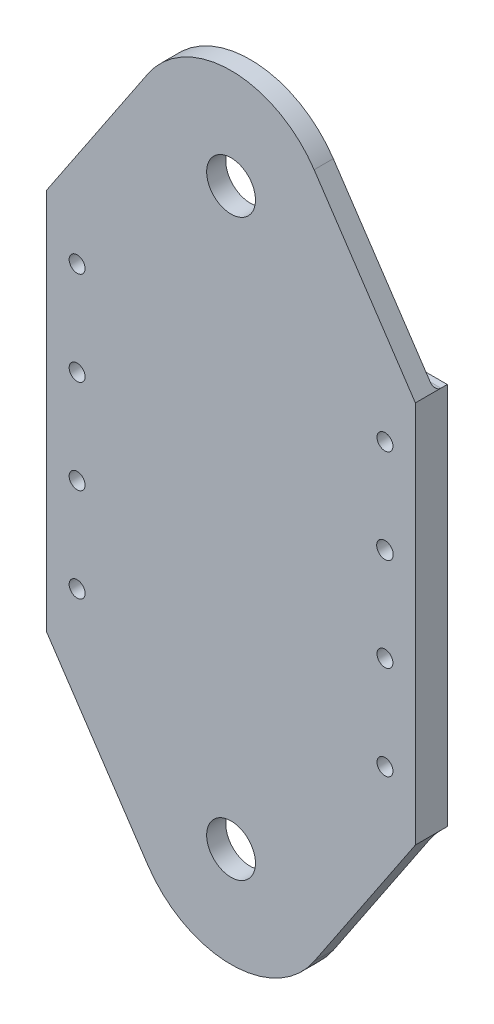
ISO-10303-21;
HEADER;
FILE_DESCRIPTION(('STEP AP214'),'2;1');
FILE_NAME('part.step','',(''),(''),'','','');
FILE_SCHEMA(('AUTOMOTIVE_DESIGN { 1 0 10303 214 1 1 1 1 }'));
ENDSEC;
DATA;
#1=APPLICATION_CONTEXT('core data for automotive mechanical design processes');
#2=APPLICATION_PROTOCOL_DEFINITION('international standard','automotive_design',2000,#1);
#3=PRODUCT_CONTEXT('',#1,'mechanical');
#4=PRODUCT('Part','Part','',(#3));
#5=PRODUCT_RELATED_PRODUCT_CATEGORY('part','',(#4));
#6=PRODUCT_DEFINITION_FORMATION('','',#4);
#7=PRODUCT_DEFINITION_CONTEXT('part definition',#1,'design');
#8=PRODUCT_DEFINITION('design','',#6,#7);
#9=PRODUCT_DEFINITION_SHAPE('','',#8);
#10=(LENGTH_UNIT() NAMED_UNIT(*) SI_UNIT(.MILLI.,.METRE.));
#11=(NAMED_UNIT(*) PLANE_ANGLE_UNIT() SI_UNIT($,.RADIAN.));
#12=(NAMED_UNIT(*) SI_UNIT($,.STERADIAN.) SOLID_ANGLE_UNIT());
#13=UNCERTAINTY_MEASURE_WITH_UNIT(LENGTH_MEASURE(1.E-05),#10,'distance_accuracy_value','');
#14=(GEOMETRIC_REPRESENTATION_CONTEXT(3) GLOBAL_UNCERTAINTY_ASSIGNED_CONTEXT((#13)) GLOBAL_UNIT_ASSIGNED_CONTEXT((#10,
#11,#12)) REPRESENTATION_CONTEXT('',''));
#15=CARTESIAN_POINT('',(0.,0.,0.));
#16=DIRECTION('',(0.,0.,1.));
#17=DIRECTION('',(1.,0.,0.));
#18=AXIS2_PLACEMENT_3D('',#15,#16,#17);
#19=CARTESIAN_POINT('',(-34.236310317154,-152.4,12.7));
#20=DIRECTION('',(0.,0.,1.));
#21=DIRECTION('',(1.,0.,0.));
#22=AXIS2_PLACEMENT_3D('',#19,#20,#21);
#23=PLANE('',#22);
#24=CARTESIAN_POINT('',(-22.1314502247129,-19.4468749363711,12.7000006965658));
#25=DIRECTION('',(-4.21051182115549E-09,-6.66920905280793E-09,-1.));
#26=DIRECTION('',(0.,1.,-6.66920905280793E-09));
#27=AXIS2_PLACEMENT_3D('',#24,#25,#26);
#28=CIRCLE('',#27,3.175);
#29=CARTESIAN_POINT('',(-22.1314502247129,-16.2718749363711,12.7000006753911));
#30=VERTEX_POINT('',#29);
#31=EDGE_CURVE('E185',#30,#30,#28,.T.);
#32=ORIENTED_EDGE('',*,*,#31,.T.);
#33=EDGE_LOOP('',(#32));
#34=FACE_BOUND('',#33,.T.);
#35=CARTESIAN_POINT('',(-22.1314502642833,-131.429124851126,12.7000014433989));
#36=DIRECTION('',(-4.21051182115549E-09,-6.66920905280793E-09,-1.));
#37=DIRECTION('',(0.,1.,-6.66920905280793E-09));
#38=AXIS2_PLACEMENT_3D('',#35,#36,#37);
#39=CIRCLE('',#38,3.175);
#40=CARTESIAN_POINT('',(-22.1314502642833,-128.254124851126,12.7000014222241));
#41=VERTEX_POINT('',#40);
#42=EDGE_CURVE('E190',#41,#41,#39,.T.);
#43=ORIENTED_EDGE('',*,*,#42,.T.);
#44=EDGE_LOOP('',(#43));
#45=FACE_BOUND('',#44,.T.);
#46=CARTESIAN_POINT('',(-22.1314502642833,-94.0911248511257,12.700001194384));
#47=DIRECTION('',(-4.21051182115549E-09,-6.66920905280793E-09,-1.));
#48=DIRECTION('',(0.,1.,-6.66920905280793E-09));
#49=AXIS2_PLACEMENT_3D('',#46,#47,#48);
#50=CIRCLE('',#49,3.175);
#51=CARTESIAN_POINT('',(-22.1314502642833,-90.9161248511257,12.7000011732092));
#52=VERTEX_POINT('',#51);
#53=EDGE_CURVE('E194',#52,#52,#50,.T.);
#54=ORIENTED_EDGE('',*,*,#53,.T.);
#55=EDGE_LOOP('',(#54));
#56=FACE_BOUND('',#55,.T.);
#57=CARTESIAN_POINT('',(-22.1314502642833,-56.7531250233898,12.700000945369));
#58=DIRECTION('',(-4.21051182115549E-09,-6.66920905280793E-09,-1.));
#59=DIRECTION('',(0.,1.,-6.66920905280793E-09));
#60=AXIS2_PLACEMENT_3D('',#57,#58,#59);
#61=CIRCLE('',#60,3.175);
#62=CARTESIAN_POINT('',(-22.1314502642833,-53.5781250233898,12.7000009241943));
#63=VERTEX_POINT('',#62);
#64=EDGE_CURVE('E198',#63,#63,#61,.T.);
#65=ORIENTED_EDGE('',*,*,#64,.T.);
#66=EDGE_LOOP('',(#65));
#67=FACE_BOUND('',#66,.T.);
#68=CARTESIAN_POINT('',(100.395913167952,-131.429124851126,12.700000927496));
#69=DIRECTION('',(-4.21051182115549E-09,-6.66920905280793E-09,-1.));
#70=DIRECTION('',(0.,1.,-6.66920905280793E-09));
#71=AXIS2_PLACEMENT_3D('',#68,#69,#70);
#72=CIRCLE('',#71,3.175);
#73=CARTESIAN_POINT('',(100.395913167952,-128.254124851126,12.7000009063212));
#74=VERTEX_POINT('',#73);
#75=EDGE_CURVE('E202',#74,#74,#72,.T.);
#76=ORIENTED_EDGE('',*,*,#75,.T.);
#77=EDGE_LOOP('',(#76));
#78=FACE_BOUND('',#77,.T.);
#79=CARTESIAN_POINT('',(100.395913167952,-94.0911248511257,12.700000678481));
#80=DIRECTION('',(-4.21051182115549E-09,-6.66920905280793E-09,-1.));
#81=DIRECTION('',(0.,1.,-6.66920905280793E-09));
#82=AXIS2_PLACEMENT_3D('',#79,#80,#81);
#83=CIRCLE('',#82,3.17500000000001);
#84=CARTESIAN_POINT('',(100.395913167952,-90.9161248511256,12.7000006573063));
#85=VERTEX_POINT('',#84);
#86=EDGE_CURVE('E206',#85,#85,#83,.T.);
#87=ORIENTED_EDGE('',*,*,#86,.T.);
#88=EDGE_LOOP('',(#87));
#89=FACE_BOUND('',#88,.T.);
#90=CARTESIAN_POINT('',(100.395913167952,-56.7531248511257,12.7000004294661));
#91=DIRECTION('',(-4.21051182115549E-09,-6.66920905280793E-09,-1.));
#92=DIRECTION('',(0.,1.,-6.66920905280793E-09));
#93=AXIS2_PLACEMENT_3D('',#90,#91,#92);
#94=CIRCLE('',#93,3.30173915819777);
#95=CARTESIAN_POINT('',(100.395913167952,-53.4513856929279,12.7000004074461));
#96=VERTEX_POINT('',#95);
#97=EDGE_CURVE('E210',#96,#96,#94,.T.);
#98=ORIENTED_EDGE('',*,*,#97,.T.);
#99=EDGE_LOOP('',(#98));
#100=FACE_BOUND('',#99,.T.);
#101=CARTESIAN_POINT('',(100.395913127435,-19.4468749153011,12.7000001806629));
#102=DIRECTION('',(-4.21051182115549E-09,-6.66920905280793E-09,-1.));
#103=DIRECTION('',(0.,1.,-6.66920905280793E-09));
#104=AXIS2_PLACEMENT_3D('',#101,#102,#103);
#105=CIRCLE('',#104,3.175);
#106=CARTESIAN_POINT('',(100.395913127435,-16.2718749153011,12.7000001594882));
#107=VERTEX_POINT('',#106);
#108=EDGE_CURVE('E214',#107,#107,#105,.T.);
#109=ORIENTED_EDGE('',*,*,#108,.T.);
#110=EDGE_LOOP('',(#109));
#111=FACE_BOUND('',#110,.T.);
#112=DIRECTION('',(0.,-1.,0.));
#113=VECTOR('',#112,1.);
#114=CARTESIAN_POINT('',(-34.236310317154,0.,12.7));
#115=LINE('',#114,#113);
#116=CARTESIAN_POINT('',(-34.236310317154,0.,12.7));
#117=VERTEX_POINT('',#116);
#118=CARTESIAN_POINT('',(-34.236310317154,-152.4,12.7));
#119=VERTEX_POINT('',#118);
#120=EDGE_CURVE('E218',#117,#119,#115,.T.);
#121=ORIENTED_EDGE('',*,*,#120,.T.);
#122=DIRECTION('',(0.556036674459193,-0.831157756780481,0.));
#123=VECTOR('',#122,1.);
#124=CARTESIAN_POINT('',(-34.236310317154,-152.4,12.7));
#125=LINE('',#124,#123);
#126=CARTESIAN_POINT('',(6.05561424166053,-212.627943894608,12.7));
#127=VERTEX_POINT('',#126);
#128=EDGE_CURVE('E157',#119,#127,#125,.T.);
#129=ORIENTED_EDGE('',*,*,#128,.T.);
#130=CARTESIAN_POINT('',(39.1322314045388,-190.5,12.7));
#131=DIRECTION('',(0.,0.,1.));
#132=DIRECTION('',(-1.,0.,0.));
#133=AXIS2_PLACEMENT_3D('',#130,#131,#132);
#134=CIRCLE('',#133,39.7958352587621);
#135=CARTESIAN_POINT('',(72.208848567417,-212.627943894608,12.7));
#136=VERTEX_POINT('',#135);
#137=EDGE_CURVE('E143',#127,#136,#134,.T.);
#138=ORIENTED_EDGE('',*,*,#137,.T.);
#139=DIRECTION('',(0.556036674459194,0.83115775678048,0.));
#140=VECTOR('',#139,1.);
#141=CARTESIAN_POINT('',(112.500773126232,-152.4,12.7));
#142=LINE('',#141,#140);
#143=CARTESIAN_POINT('',(112.500773126232,-152.4,12.7));
#144=VERTEX_POINT('',#143);
#145=EDGE_CURVE('E154',#136,#144,#142,.T.);
#146=ORIENTED_EDGE('',*,*,#145,.T.);
#147=DIRECTION('',(0.,1.,0.));
#148=VECTOR('',#147,1.);
#149=CARTESIAN_POINT('',(112.500773126232,0.,12.7));
#150=LINE('',#149,#148);
#151=CARTESIAN_POINT('',(112.500773126232,0.,12.7));
#152=VERTEX_POINT('',#151);
#153=EDGE_CURVE('E221',#144,#152,#150,.T.);
#154=ORIENTED_EDGE('',*,*,#153,.T.);
#155=DIRECTION('',(-0.556036674459194,0.83115775678048,0.));
#156=VECTOR('',#155,1.);
#157=CARTESIAN_POINT('',(112.500773126232,0.,12.7));
#158=LINE('',#157,#156);
#159=CARTESIAN_POINT('',(72.208848567417,60.227943894608,12.7));
#160=VERTEX_POINT('',#159);
#161=EDGE_CURVE('E176',#152,#160,#158,.T.);
#162=ORIENTED_EDGE('',*,*,#161,.T.);
#163=CARTESIAN_POINT('',(39.1322314045388,38.1,12.7));
#164=DIRECTION('',(0.,0.,1.));
#165=DIRECTION('',(1.,0.,0.));
#166=AXIS2_PLACEMENT_3D('',#163,#164,#165);
#167=CIRCLE('',#166,39.7958352587621);
#168=CARTESIAN_POINT('',(6.05561424166053,60.227943894608,12.7));
#169=VERTEX_POINT('',#168);
#170=EDGE_CURVE('E179',#160,#169,#167,.T.);
#171=ORIENTED_EDGE('',*,*,#170,.T.);
#172=DIRECTION('',(-0.556036674459192,-0.831157756780481,0.));
#173=VECTOR('',#172,1.);
#174=CARTESIAN_POINT('',(-34.236310317154,0.,12.7));
#175=LINE('',#174,#173);
#176=EDGE_CURVE('E166',#169,#117,#175,.T.);
#177=ORIENTED_EDGE('',*,*,#176,.T.);
#178=EDGE_LOOP('',(#121,#129,#138,#146,#154,#162,#171,#177));
#179=FACE_BOUND('',#178,.T.);
#180=CARTESIAN_POINT('',(39.1322314045388,38.1,12.7));
#181=DIRECTION('',(0.,0.,1.));
#182=DIRECTION('',(1.,0.,0.));
#183=AXIS2_PLACEMENT_3D('',#180,#181,#182);
#184=CIRCLE('',#183,9.71153050508892);
#185=CARTESIAN_POINT('',(48.8437619096277,38.1,12.7));
#186=VERTEX_POINT('',#185);
#187=EDGE_CURVE('E161',#186,#186,#184,.T.);
#188=ORIENTED_EDGE('',*,*,#187,.F.);
#189=EDGE_LOOP('',(#188));
#190=FACE_BOUND('',#189,.T.);
#191=CARTESIAN_POINT('',(39.1322314045388,-190.5,12.7));
#192=DIRECTION('',(0.,0.,1.));
#193=DIRECTION('',(-1.,0.,0.));
#194=AXIS2_PLACEMENT_3D('',#191,#192,#193);
#195=CIRCLE('',#194,9.7115305050889);
#196=CARTESIAN_POINT('',(48.8437619096277,-190.5,12.7));
#197=VERTEX_POINT('',#196);
#198=EDGE_CURVE('E152',#197,#197,#195,.T.);
#199=ORIENTED_EDGE('',*,*,#198,.F.);
#200=EDGE_LOOP('',(#199));
#201=FACE_BOUND('',#200,.T.);
#202=ADVANCED_FACE('F33',(#34,#45,#56,#67,#78,#89,#100,#111,#179,#190,#201),#23,.T.);
#203=CARTESIAN_POINT('',(-34.236310317154,-152.4,0.));
#204=DIRECTION('',(0.,0.,1.));
#205=DIRECTION('',(1.,0.,0.));
#206=AXIS2_PLACEMENT_3D('',#203,#204,#205);
#207=PLANE('',#206);
#208=CARTESIAN_POINT('',(-22.1314502781864,-19.4468750210701,0.));
#209=DIRECTION('',(0.,0.,1.));
#210=DIRECTION('',(1.,0.,0.));
#211=AXIS2_PLACEMENT_3D('',#208,#209,#210);
#212=CIRCLE('',#211,3.175);
#213=CARTESIAN_POINT('',(-18.9564502781864,-19.4468750210701,0.));
#214=VERTEX_POINT('',#213);
#215=EDGE_CURVE('E189',#214,#214,#212,.T.);
#216=ORIENTED_EDGE('',*,*,#215,.T.);
#217=EDGE_LOOP('',(#216));
#218=FACE_BOUND('',#217,.T.);
#219=CARTESIAN_POINT('',(-22.1314503177568,-131.429124935825,0.));
#220=DIRECTION('',(0.,0.,1.));
#221=DIRECTION('',(1.,0.,0.));
#222=AXIS2_PLACEMENT_3D('',#219,#220,#221);
#223=CIRCLE('',#222,3.175);
#224=CARTESIAN_POINT('',(-18.9564503177568,-131.429124935825,0.));
#225=VERTEX_POINT('',#224);
#226=EDGE_CURVE('E193',#225,#225,#223,.T.);
#227=ORIENTED_EDGE('',*,*,#226,.T.);
#228=EDGE_LOOP('',(#227));
#229=FACE_BOUND('',#228,.T.);
#230=CARTESIAN_POINT('',(-22.1314503177568,-94.0911249358246,0.));
#231=DIRECTION('',(0.,0.,1.));
#232=DIRECTION('',(1.,0.,0.));
#233=AXIS2_PLACEMENT_3D('',#230,#231,#232);
#234=CIRCLE('',#233,3.175);
#235=CARTESIAN_POINT('',(-18.9564503177568,-94.0911249358246,0.));
#236=VERTEX_POINT('',#235);
#237=EDGE_CURVE('E197',#236,#236,#234,.T.);
#238=ORIENTED_EDGE('',*,*,#237,.T.);
#239=EDGE_LOOP('',(#238));
#240=FACE_BOUND('',#239,.T.);
#241=CARTESIAN_POINT('',(-22.1314503177568,-56.7531251080887,0.));
#242=DIRECTION('',(0.,0.,1.));
#243=DIRECTION('',(1.,0.,0.));
#244=AXIS2_PLACEMENT_3D('',#241,#242,#243);
#245=CIRCLE('',#244,3.175);
#246=CARTESIAN_POINT('',(-18.9564503177568,-56.7531251080887,0.));
#247=VERTEX_POINT('',#246);
#248=EDGE_CURVE('E201',#247,#247,#245,.T.);
#249=ORIENTED_EDGE('',*,*,#248,.T.);
#250=EDGE_LOOP('',(#249));
#251=FACE_BOUND('',#250,.T.);
#252=CARTESIAN_POINT('',(100.395913114478,-131.429124935825,0.));
#253=DIRECTION('',(0.,0.,1.));
#254=DIRECTION('',(1.,0.,0.));
#255=AXIS2_PLACEMENT_3D('',#252,#253,#254);
#256=CIRCLE('',#255,3.175);
#257=CARTESIAN_POINT('',(103.570913114478,-131.429124935825,0.));
#258=VERTEX_POINT('',#257);
#259=EDGE_CURVE('E205',#258,#258,#256,.T.);
#260=ORIENTED_EDGE('',*,*,#259,.T.);
#261=EDGE_LOOP('',(#260));
#262=FACE_BOUND('',#261,.T.);
#263=CARTESIAN_POINT('',(100.395913114478,-94.0911249358246,0.));
#264=DIRECTION('',(0.,0.,1.));
#265=DIRECTION('',(1.,0.,0.));
#266=AXIS2_PLACEMENT_3D('',#263,#264,#265);
#267=CIRCLE('',#266,3.17500000000001);
#268=CARTESIAN_POINT('',(103.570913114478,-94.0911249358246,0.));
#269=VERTEX_POINT('',#268);
#270=EDGE_CURVE('E209',#269,#269,#267,.T.);
#271=ORIENTED_EDGE('',*,*,#270,.T.);
#272=EDGE_LOOP('',(#271));
#273=FACE_BOUND('',#272,.T.);
#274=CARTESIAN_POINT('',(100.395913114478,-56.7531249358246,0.));
#275=DIRECTION('',(0.,0.,1.));
#276=DIRECTION('',(1.,0.,0.));
#277=AXIS2_PLACEMENT_3D('',#274,#275,#276);
#278=CIRCLE('',#277,3.30173915819777);
#279=CARTESIAN_POINT('',(103.697652272676,-56.7531249358246,0.));
#280=VERTEX_POINT('',#279);
#281=EDGE_CURVE('E213',#280,#280,#278,.T.);
#282=ORIENTED_EDGE('',*,*,#281,.T.);
#283=EDGE_LOOP('',(#282));
#284=FACE_BOUND('',#283,.T.);
#285=CARTESIAN_POINT('',(100.395913073962,-19.446875,0.));
#286=DIRECTION('',(0.,0.,1.));
#287=DIRECTION('',(1.,0.,0.));
#288=AXIS2_PLACEMENT_3D('',#285,#286,#287);
#289=CIRCLE('',#288,3.175);
#290=CARTESIAN_POINT('',(103.570913073962,-19.446875,0.));
#291=VERTEX_POINT('',#290);
#292=EDGE_CURVE('E217',#291,#291,#289,.T.);
#293=ORIENTED_EDGE('',*,*,#292,.T.);
#294=EDGE_LOOP('',(#293));
#295=FACE_BOUND('',#294,.T.);
#296=DIRECTION('',(0.,-1.,0.));
#297=VECTOR('',#296,1.);
#298=CARTESIAN_POINT('',(-34.236310317154,0.,0.));
#299=LINE('',#298,#297);
#300=CARTESIAN_POINT('',(-34.236310317154,0.,0.));
#301=VERTEX_POINT('',#300);
#302=CARTESIAN_POINT('',(-34.236310317154,-152.4,0.));
#303=VERTEX_POINT('',#302);
#304=EDGE_CURVE('E226',#301,#303,#299,.T.);
#305=ORIENTED_EDGE('',*,*,#304,.F.);
#306=DIRECTION('',(-1.,0.,0.));
#307=VECTOR('',#306,1.);
#308=CARTESIAN_POINT('',(-34.236310317154,0.,0.));
#309=LINE('',#308,#307);
#310=CARTESIAN_POINT('',(112.500773126232,0.,0.));
#311=VERTEX_POINT('',#310);
#312=EDGE_CURVE('E222',#311,#301,#309,.T.);
#313=ORIENTED_EDGE('',*,*,#312,.F.);
#314=DIRECTION('',(0.,1.,0.));
#315=VECTOR('',#314,1.);
#316=CARTESIAN_POINT('',(112.500773126232,0.,0.));
#317=LINE('',#316,#315);
#318=CARTESIAN_POINT('',(112.500773126232,-152.4,0.));
#319=VERTEX_POINT('',#318);
#320=EDGE_CURVE('E232',#319,#311,#317,.T.);
#321=ORIENTED_EDGE('',*,*,#320,.F.);
#322=DIRECTION('',(1.,0.,0.));
#323=VECTOR('',#322,1.);
#324=CARTESIAN_POINT('',(-34.236310317154,-152.4,0.));
#325=LINE('',#324,#323);
#326=EDGE_CURVE('E229',#303,#319,#325,.T.);
#327=ORIENTED_EDGE('',*,*,#326,.F.);
#328=EDGE_LOOP('',(#305,#313,#321,#327));
#329=FACE_BOUND('',#328,.T.);
#330=ADVANCED_FACE('F325',(#218,#229,#240,#251,#262,#273,#284,#295,#329),#207,.F.);
#331=CARTESIAN_POINT('',(-34.236310317154,0.,12.7));
#332=DIRECTION('',(1.,0.,0.));
#333=DIRECTION('',(0.,0.,-1.));
#334=AXIS2_PLACEMENT_3D('',#331,#332,#333);
#335=PLANE('',#334);
#336=ORIENTED_EDGE('',*,*,#304,.T.);
#337=DIRECTION('',(0.,0.,-1.));
#338=VECTOR('',#337,1.);
#339=CARTESIAN_POINT('',(-34.236310317154,-152.4,12.7));
#340=LINE('',#339,#338);
#341=CARTESIAN_POINT('',(-34.236310317154,-152.4,2.54));
#342=VERTEX_POINT('',#341);
#343=EDGE_CURVE('E308',#342,#303,#340,.T.);
#344=ORIENTED_EDGE('',*,*,#343,.F.);
#345=EDGE_CURVE('E296',#119,#342,#340,.T.);
#346=ORIENTED_EDGE('',*,*,#345,.F.);
#347=ORIENTED_EDGE('',*,*,#120,.F.);
#348=DIRECTION('',(0.,0.,-1.));
#349=VECTOR('',#348,1.);
#350=CARTESIAN_POINT('',(-34.236310317154,0.,12.7));
#351=LINE('',#350,#349);
#352=CARTESIAN_POINT('',(-34.236310317154,0.,2.54));
#353=VERTEX_POINT('',#352);
#354=EDGE_CURVE('E48',#117,#353,#351,.T.);
#355=ORIENTED_EDGE('',*,*,#354,.T.);
#356=EDGE_CURVE('E225',#353,#301,#351,.T.);
#357=ORIENTED_EDGE('',*,*,#356,.T.);
#358=EDGE_LOOP('',(#336,#344,#346,#347,#355,#357));
#359=FACE_BOUND('',#358,.T.);
#360=ADVANCED_FACE('F323',(#359),#335,.F.);
#361=CARTESIAN_POINT('',(-34.236310317154,-152.4,12.7));
#362=DIRECTION('',(0.,1.,0.));
#363=DIRECTION('',(0.,0.,1.));
#364=AXIS2_PLACEMENT_3D('',#361,#362,#363);
#365=PLANE('',#364);
#366=DIRECTION('',(0.,0.,-1.));
#367=VECTOR('',#366,1.);
#368=CARTESIAN_POINT('',(112.500773126232,-152.4,12.7));
#369=LINE('',#368,#367);
#370=CARTESIAN_POINT('',(112.500773126232,-152.4,2.54));
#371=VERTEX_POINT('',#370);
#372=EDGE_CURVE('E251',#371,#319,#369,.T.);
#373=ORIENTED_EDGE('',*,*,#372,.F.);
#374=DIRECTION('',(-1.,0.,0.));
#375=VECTOR('',#374,1.);
#376=CARTESIAN_POINT('',(-34.236310317154,-152.4,2.54));
#377=LINE('',#376,#375);
#378=EDGE_CURVE('E294',#371,#342,#377,.T.);
#379=ORIENTED_EDGE('',*,*,#378,.T.);
#380=ORIENTED_EDGE('',*,*,#343,.T.);
#381=ORIENTED_EDGE('',*,*,#326,.T.);
#382=EDGE_LOOP('',(#373,#379,#380,#381));
#383=FACE_BOUND('',#382,.T.);
#384=ADVANCED_FACE('F322',(#383),#365,.F.);
#385=CARTESIAN_POINT('',(112.500773126232,0.,12.7));
#386=DIRECTION('',(-1.,0.,0.));
#387=DIRECTION('',(0.,0.,1.));
#388=AXIS2_PLACEMENT_3D('',#385,#386,#387);
#389=PLANE('',#388);
#390=ORIENTED_EDGE('',*,*,#320,.T.);
#391=DIRECTION('',(0.,0.,-1.));
#392=VECTOR('',#391,1.);
#393=CARTESIAN_POINT('',(112.500773126232,0.,12.7));
#394=LINE('',#393,#392);
#395=CARTESIAN_POINT('',(112.500773126232,0.,2.54));
#396=VERTEX_POINT('',#395);
#397=EDGE_CURVE('E248',#396,#311,#394,.T.);
#398=ORIENTED_EDGE('',*,*,#397,.F.);
#399=EDGE_CURVE('E70',#152,#396,#394,.T.);
#400=ORIENTED_EDGE('',*,*,#399,.F.);
#401=ORIENTED_EDGE('',*,*,#153,.F.);
#402=EDGE_CURVE('E57',#144,#371,#369,.T.);
#403=ORIENTED_EDGE('',*,*,#402,.T.);
#404=ORIENTED_EDGE('',*,*,#372,.T.);
#405=EDGE_LOOP('',(#390,#398,#400,#401,#403,#404));
#406=FACE_BOUND('',#405,.T.);
#407=ADVANCED_FACE('F287',(#406),#389,.F.);
#408=CARTESIAN_POINT('',(-34.236310317154,0.,12.7));
#409=DIRECTION('',(0.,-1.,0.));
#410=DIRECTION('',(0.,0.,-1.));
#411=AXIS2_PLACEMENT_3D('',#408,#409,#410);
#412=PLANE('',#411);
#413=ORIENTED_EDGE('',*,*,#356,.F.);
#414=DIRECTION('',(1.,0.,0.));
#415=VECTOR('',#414,1.);
#416=CARTESIAN_POINT('',(112.500773126232,0.,2.54));
#417=LINE('',#416,#415);
#418=EDGE_CURVE('E258',#353,#396,#417,.T.);
#419=ORIENTED_EDGE('',*,*,#418,.T.);
#420=ORIENTED_EDGE('',*,*,#397,.T.);
#421=ORIENTED_EDGE('',*,*,#312,.T.);
#422=EDGE_LOOP('',(#413,#419,#420,#421));
#423=FACE_BOUND('',#422,.T.);
#424=ADVANCED_FACE('F291',(#423),#412,.F.);
#425=CARTESIAN_POINT('',(100.395913127435,-19.4468749153011,12.7000001806629));
#426=DIRECTION('',(-4.21051182115549E-09,-6.66920905280793E-09,-1.));
#427=DIRECTION('',(0.,1.,-6.66920905280793E-09));
#428=AXIS2_PLACEMENT_3D('',#425,#426,#427);
#429=CYLINDRICAL_SURFACE('',#428,3.175);
#430=ORIENTED_EDGE('',*,*,#108,.F.);
#431=EDGE_LOOP('',(#430));
#432=FACE_BOUND('',#431,.T.);
#433=ORIENTED_EDGE('',*,*,#292,.F.);
#434=EDGE_LOOP('',(#433));
#435=FACE_BOUND('',#434,.T.);
#436=ADVANCED_FACE('F342',(#432,#435),#429,.F.);
#437=CARTESIAN_POINT('',(100.395913167952,-56.7531248511257,12.7000004294661));
#438=DIRECTION('',(-4.21051182115549E-09,-6.66920905280793E-09,-1.));
#439=DIRECTION('',(0.,1.,-6.66920905280793E-09));
#440=AXIS2_PLACEMENT_3D('',#437,#438,#439);
#441=CYLINDRICAL_SURFACE('',#440,3.30173915819777);
#442=ORIENTED_EDGE('',*,*,#97,.F.);
#443=EDGE_LOOP('',(#442));
#444=FACE_BOUND('',#443,.T.);
#445=ORIENTED_EDGE('',*,*,#281,.F.);
#446=EDGE_LOOP('',(#445));
#447=FACE_BOUND('',#446,.T.);
#448=ADVANCED_FACE('F406',(#444,#447),#441,.F.);
#449=CARTESIAN_POINT('',(100.395913167952,-94.0911248511257,12.700000678481));
#450=DIRECTION('',(-4.21051182115549E-09,-6.66920905280793E-09,-1.));
#451=DIRECTION('',(0.,1.,-6.66920905280793E-09));
#452=AXIS2_PLACEMENT_3D('',#449,#450,#451);
#453=CYLINDRICAL_SURFACE('',#452,3.17500000000001);
#454=ORIENTED_EDGE('',*,*,#86,.F.);
#455=EDGE_LOOP('',(#454));
#456=FACE_BOUND('',#455,.T.);
#457=ORIENTED_EDGE('',*,*,#270,.F.);
#458=EDGE_LOOP('',(#457));
#459=FACE_BOUND('',#458,.T.);
#460=ADVANCED_FACE('F402',(#456,#459),#453,.F.);
#461=CARTESIAN_POINT('',(100.395913167952,-131.429124851126,12.700000927496));
#462=DIRECTION('',(-4.21051182115549E-09,-6.66920905280793E-09,-1.));
#463=DIRECTION('',(0.,1.,-6.66920905280793E-09));
#464=AXIS2_PLACEMENT_3D('',#461,#462,#463);
#465=CYLINDRICAL_SURFACE('',#464,3.175);
#466=ORIENTED_EDGE('',*,*,#75,.F.);
#467=EDGE_LOOP('',(#466));
#468=FACE_BOUND('',#467,.T.);
#469=ORIENTED_EDGE('',*,*,#259,.F.);
#470=EDGE_LOOP('',(#469));
#471=FACE_BOUND('',#470,.T.);
#472=ADVANCED_FACE('F398',(#468,#471),#465,.F.);
#473=CARTESIAN_POINT('',(-22.1314502642833,-56.7531250233898,12.700000945369));
#474=DIRECTION('',(-4.21051182115549E-09,-6.66920905280793E-09,-1.));
#475=DIRECTION('',(0.,1.,-6.66920905280793E-09));
#476=AXIS2_PLACEMENT_3D('',#473,#474,#475);
#477=CYLINDRICAL_SURFACE('',#476,3.175);
#478=ORIENTED_EDGE('',*,*,#64,.F.);
#479=EDGE_LOOP('',(#478));
#480=FACE_BOUND('',#479,.T.);
#481=ORIENTED_EDGE('',*,*,#248,.F.);
#482=EDGE_LOOP('',(#481));
#483=FACE_BOUND('',#482,.T.);
#484=ADVANCED_FACE('F394',(#480,#483),#477,.F.);
#485=CARTESIAN_POINT('',(-22.1314502642833,-94.0911248511257,12.700001194384));
#486=DIRECTION('',(-4.21051182115549E-09,-6.66920905280793E-09,-1.));
#487=DIRECTION('',(0.,1.,-6.66920905280793E-09));
#488=AXIS2_PLACEMENT_3D('',#485,#486,#487);
#489=CYLINDRICAL_SURFACE('',#488,3.175);
#490=ORIENTED_EDGE('',*,*,#53,.F.);
#491=EDGE_LOOP('',(#490));
#492=FACE_BOUND('',#491,.T.);
#493=ORIENTED_EDGE('',*,*,#237,.F.);
#494=EDGE_LOOP('',(#493));
#495=FACE_BOUND('',#494,.T.);
#496=ADVANCED_FACE('F390',(#492,#495),#489,.F.);
#497=CARTESIAN_POINT('',(-22.1314502642833,-131.429124851126,12.7000014433989));
#498=DIRECTION('',(-4.21051182115549E-09,-6.66920905280793E-09,-1.));
#499=DIRECTION('',(0.,1.,-6.66920905280793E-09));
#500=AXIS2_PLACEMENT_3D('',#497,#498,#499);
#501=CYLINDRICAL_SURFACE('',#500,3.175);
#502=ORIENTED_EDGE('',*,*,#42,.F.);
#503=EDGE_LOOP('',(#502));
#504=FACE_BOUND('',#503,.T.);
#505=ORIENTED_EDGE('',*,*,#226,.F.);
#506=EDGE_LOOP('',(#505));
#507=FACE_BOUND('',#506,.T.);
#508=ADVANCED_FACE('F386',(#504,#507),#501,.F.);
#509=CARTESIAN_POINT('',(-22.1314502247129,-19.4468749363711,12.7000006965658));
#510=DIRECTION('',(-4.21051182115549E-09,-6.66920905280793E-09,-1.));
#511=DIRECTION('',(0.,1.,-6.66920905280793E-09));
#512=AXIS2_PLACEMENT_3D('',#509,#510,#511);
#513=CYLINDRICAL_SURFACE('',#512,3.175);
#514=ORIENTED_EDGE('',*,*,#31,.F.);
#515=EDGE_LOOP('',(#514));
#516=FACE_BOUND('',#515,.T.);
#517=ORIENTED_EDGE('',*,*,#215,.F.);
#518=EDGE_LOOP('',(#517));
#519=FACE_BOUND('',#518,.T.);
#520=ADVANCED_FACE('F383',(#516,#519),#513,.F.);
#521=CARTESIAN_POINT('',(-34.236310317154,0.,5.08));
#522=DIRECTION('',(-0.831157756780481,0.556036674459192,0.));
#523=DIRECTION('',(-0.556036674459192,-0.831157756780482,0.));
#524=AXIS2_PLACEMENT_3D('',#521,#522,#523);
#525=PLANE('',#524);
#526=ORIENTED_EDGE('',*,*,#176,.F.);
#527=DIRECTION('',(0.,0.,1.));
#528=VECTOR('',#527,1.);
#529=CARTESIAN_POINT('',(6.05561424166053,60.227943894608,5.08));
#530=LINE('',#529,#528);
#531=CARTESIAN_POINT('',(6.05561424166053,60.227943894608,5.08));
#532=VERTEX_POINT('',#531);
#533=EDGE_CURVE('E183',#532,#169,#530,.T.);
#534=ORIENTED_EDGE('',*,*,#533,.F.);
#535=DIRECTION('',(-0.556036674459192,-0.831157756780481,0.));
#536=VECTOR('',#535,1.);
#537=CARTESIAN_POINT('',(-34.236310317154,0.,5.08));
#538=LINE('',#537,#536);
#539=CARTESIAN_POINT('',(-32.5370743518938,2.54,5.08));
#540=VERTEX_POINT('',#539);
#541=EDGE_CURVE('E182',#532,#540,#538,.T.);
#542=ORIENTED_EDGE('',*,*,#541,.T.);
#543=CARTESIAN_POINT('',(-32.5370743518938,2.54,2.54));
#544=DIRECTION('',(-0.831157756780481,0.556036674459192,0.));
#545=DIRECTION('',(-0.556036674459192,-0.831157756780482,0.));
#546=AXIS2_PLACEMENT_3D('',#543,#544,#545);
#547=ELLIPSE('',#546,3.05597821746714,2.54);
#548=EDGE_CURVE('E11',#540,#353,#547,.F.);
#549=ORIENTED_EDGE('',*,*,#548,.T.);
#550=ORIENTED_EDGE('',*,*,#354,.F.);
#551=EDGE_LOOP('',(#526,#534,#542,#549,#550));
#552=FACE_BOUND('',#551,.T.);
#553=ADVANCED_FACE('F279',(#552),#525,.T.);
#554=CARTESIAN_POINT('',(39.1322314045388,38.1,5.08));
#555=DIRECTION('',(0.,0.,1.));
#556=DIRECTION('',(1.,0.,0.));
#557=AXIS2_PLACEMENT_3D('',#554,#555,#556);
#558=CYLINDRICAL_SURFACE('',#557,39.7958352587621);
#559=ORIENTED_EDGE('',*,*,#170,.F.);
#560=DIRECTION('',(0.,0.,1.));
#561=VECTOR('',#560,1.);
#562=CARTESIAN_POINT('',(72.208848567417,60.227943894608,5.08));
#563=LINE('',#562,#561);
#564=CARTESIAN_POINT('',(72.208848567417,60.227943894608,5.08));
#565=VERTEX_POINT('',#564);
#566=EDGE_CURVE('E172',#565,#160,#563,.T.);
#567=ORIENTED_EDGE('',*,*,#566,.F.);
#568=CARTESIAN_POINT('',(39.1322314045388,38.1,5.08));
#569=DIRECTION('',(0.,0.,1.));
#570=DIRECTION('',(1.,0.,0.));
#571=AXIS2_PLACEMENT_3D('',#568,#569,#570);
#572=CIRCLE('',#571,39.7958352587621);
#573=EDGE_CURVE('E169',#565,#532,#572,.T.);
#574=ORIENTED_EDGE('',*,*,#573,.T.);
#575=ORIENTED_EDGE('',*,*,#533,.T.);
#576=EDGE_LOOP('',(#559,#567,#574,#575));
#577=FACE_BOUND('',#576,.T.);
#578=ADVANCED_FACE('F282',(#577),#558,.T.);
#579=CARTESIAN_POINT('',(112.500773126232,0.,5.08));
#580=DIRECTION('',(0.83115775678048,0.556036674459195,0.));
#581=DIRECTION('',(-0.556036674459195,0.83115775678048,0.));
#582=AXIS2_PLACEMENT_3D('',#579,#580,#581);
#583=PLANE('',#582);
#584=ORIENTED_EDGE('',*,*,#161,.F.);
#585=ORIENTED_EDGE('',*,*,#399,.T.);
#586=CARTESIAN_POINT('',(110.801537160972,2.54,2.54));
#587=DIRECTION('',(0.83115775678048,0.556036674459195,0.));
#588=DIRECTION('',(-0.556036674459195,0.83115775678048,0.));
#589=AXIS2_PLACEMENT_3D('',#586,#587,#588);
#590=ELLIPSE('',#589,3.05597821746714,2.54);
#591=CARTESIAN_POINT('',(110.801537160972,2.54,5.08));
#592=VERTEX_POINT('',#591);
#593=EDGE_CURVE('E41',#396,#592,#590,.F.);
#594=ORIENTED_EDGE('',*,*,#593,.T.);
#595=DIRECTION('',(-0.556036674459194,0.83115775678048,0.));
#596=VECTOR('',#595,1.);
#597=CARTESIAN_POINT('',(112.500773126232,0.,5.08));
#598=LINE('',#597,#596);
#599=EDGE_CURVE('E173',#592,#565,#598,.T.);
#600=ORIENTED_EDGE('',*,*,#599,.T.);
#601=ORIENTED_EDGE('',*,*,#566,.T.);
#602=EDGE_LOOP('',(#584,#585,#594,#600,#601));
#603=FACE_BOUND('',#602,.T.);
#604=ADVANCED_FACE('F265',(#603),#583,.T.);
#605=CARTESIAN_POINT('',(39.1322314045388,38.1,5.08));
#606=DIRECTION('',(0.,0.,1.));
#607=DIRECTION('',(1.,0.,0.));
#608=AXIS2_PLACEMENT_3D('',#605,#606,#607);
#609=PLANE('',#608);
#610=CARTESIAN_POINT('',(39.1322314045388,38.1,5.08));
#611=DIRECTION('',(0.,0.,1.));
#612=DIRECTION('',(1.,0.,0.));
#613=AXIS2_PLACEMENT_3D('',#610,#611,#612);
#614=CIRCLE('',#613,9.71153050508892);
#615=CARTESIAN_POINT('',(48.8437619096277,38.1,5.08));
#616=VERTEX_POINT('',#615);
#617=EDGE_CURVE('E163',#616,#616,#614,.T.);
#618=ORIENTED_EDGE('',*,*,#617,.T.);
#619=EDGE_LOOP('',(#618));
#620=FACE_BOUND('',#619,.T.);
#621=ORIENTED_EDGE('',*,*,#599,.F.);
#622=DIRECTION('',(1.,0.,0.));
#623=VECTOR('',#622,1.);
#624=CARTESIAN_POINT('',(-34.236310317154,2.54,5.08));
#625=LINE('',#624,#623);
#626=EDGE_CURVE('E259',#592,#540,#625,.F.);
#627=ORIENTED_EDGE('',*,*,#626,.T.);
#628=ORIENTED_EDGE('',*,*,#541,.F.);
#629=ORIENTED_EDGE('',*,*,#573,.F.);
#630=EDGE_LOOP('',(#621,#627,#628,#629));
#631=FACE_BOUND('',#630,.T.);
#632=ADVANCED_FACE('F273',(#620,#631),#609,.F.);
#633=CARTESIAN_POINT('',(39.1322314045388,38.1,5.08));
#634=DIRECTION('',(0.,0.,1.));
#635=DIRECTION('',(1.,0.,0.));
#636=AXIS2_PLACEMENT_3D('',#633,#634,#635);
#637=CYLINDRICAL_SURFACE('',#636,9.71153050508892);
#638=CARTESIAN_POINT('',(48.8437619096277,38.1,5.08));
#639=CARTESIAN_POINT('',(48.8437619096277,38.1,5.159375));
#640=CARTESIAN_POINT('',(48.8437619096277,38.1,5.23875));
#641=CARTESIAN_POINT('',(48.8437619096277,38.1,5.3975));
#642=CARTESIAN_POINT('',(48.8437619096277,38.1,5.476875));
#643=CARTESIAN_POINT('',(48.8437619096277,38.1,5.635625));
#644=CARTESIAN_POINT('',(48.8437619096277,38.1,5.715));
#645=CARTESIAN_POINT('',(48.8437619096277,38.1,5.87375));
#646=CARTESIAN_POINT('',(48.8437619096277,38.1,5.953125));
#647=CARTESIAN_POINT('',(48.8437619096277,38.1,6.111875));
#648=CARTESIAN_POINT('',(48.8437619096277,38.1,6.19125));
#649=CARTESIAN_POINT('',(48.8437619096277,38.1,6.35));
#650=CARTESIAN_POINT('',(48.8437619096277,38.1,6.429375));
#651=CARTESIAN_POINT('',(48.8437619096277,38.1,6.588125));
#652=CARTESIAN_POINT('',(48.8437619096277,38.1,6.6675));
#653=CARTESIAN_POINT('',(48.8437619096277,38.1,6.82625));
#654=CARTESIAN_POINT('',(48.8437619096277,38.1,6.905625));
#655=CARTESIAN_POINT('',(48.8437619096277,38.1,7.064375));
#656=CARTESIAN_POINT('',(48.8437619096277,38.1,7.14375));
#657=CARTESIAN_POINT('',(48.8437619096277,38.1,7.3025));
#658=CARTESIAN_POINT('',(48.8437619096277,38.1,7.381875));
#659=CARTESIAN_POINT('',(48.8437619096277,38.1,7.540625));
#660=CARTESIAN_POINT('',(48.8437619096277,38.1,7.62));
#661=CARTESIAN_POINT('',(48.8437619096277,38.1,7.77875));
#662=CARTESIAN_POINT('',(48.8437619096277,38.1,7.858125));
#663=CARTESIAN_POINT('',(48.8437619096277,38.1,8.016875));
#664=CARTESIAN_POINT('',(48.8437619096277,38.1,8.09625));
#665=CARTESIAN_POINT('',(48.8437619096277,38.1,8.255));
#666=CARTESIAN_POINT('',(48.8437619096277,38.1,8.334375));
#667=CARTESIAN_POINT('',(48.8437619096277,38.1,8.493125));
#668=CARTESIAN_POINT('',(48.8437619096277,38.1,8.5725));
#669=CARTESIAN_POINT('',(48.8437619096277,38.1,8.73125));
#670=CARTESIAN_POINT('',(48.8437619096277,38.1,8.810625));
#671=CARTESIAN_POINT('',(48.8437619096277,38.1,8.969375));
#672=CARTESIAN_POINT('',(48.8437619096277,38.1,9.04875));
#673=CARTESIAN_POINT('',(48.8437619096277,38.1,9.2075));
#674=CARTESIAN_POINT('',(48.8437619096277,38.1,9.286875));
#675=CARTESIAN_POINT('',(48.8437619096277,38.1,9.445625));
#676=CARTESIAN_POINT('',(48.8437619096277,38.1,9.525));
#677=CARTESIAN_POINT('',(48.8437619096277,38.1,9.68375));
#678=CARTESIAN_POINT('',(48.8437619096277,38.1,9.763125));
#679=CARTESIAN_POINT('',(48.8437619096277,38.1,9.921875));
#680=CARTESIAN_POINT('',(48.8437619096277,38.1,10.00125));
#681=CARTESIAN_POINT('',(48.8437619096277,38.1,10.16));
#682=CARTESIAN_POINT('',(48.8437619096277,38.1,10.239375));
#683=CARTESIAN_POINT('',(48.8437619096277,38.1,10.398125));
#684=CARTESIAN_POINT('',(48.8437619096277,38.1,10.4775));
#685=CARTESIAN_POINT('',(48.8437619096277,38.1,10.63625));
#686=CARTESIAN_POINT('',(48.8437619096277,38.1,10.715625));
#687=CARTESIAN_POINT('',(48.8437619096277,38.1,10.874375));
#688=CARTESIAN_POINT('',(48.8437619096277,38.1,10.95375));
#689=CARTESIAN_POINT('',(48.8437619096277,38.1,11.1125));
#690=CARTESIAN_POINT('',(48.8437619096277,38.1,11.191875));
#691=CARTESIAN_POINT('',(48.8437619096277,38.1,11.350625));
#692=CARTESIAN_POINT('',(48.8437619096277,38.1,11.43));
#693=CARTESIAN_POINT('',(48.8437619096277,38.1,11.58875));
#694=CARTESIAN_POINT('',(48.8437619096277,38.1,11.668125));
#695=CARTESIAN_POINT('',(48.8437619096277,38.1,11.826875));
#696=CARTESIAN_POINT('',(48.8437619096277,38.1,11.90625));
#697=CARTESIAN_POINT('',(48.8437619096277,38.1,12.065));
#698=CARTESIAN_POINT('',(48.8437619096277,38.1,12.144375));
#699=CARTESIAN_POINT('',(48.8437619096277,38.1,12.303125));
#700=CARTESIAN_POINT('',(48.8437619096277,38.1,12.3825));
#701=CARTESIAN_POINT('',(48.8437619096277,38.1,12.54125));
#702=CARTESIAN_POINT('',(48.8437619096277,38.1,12.620625));
#703=CARTESIAN_POINT('',(48.8437619096277,38.1,12.7));
#704=B_SPLINE_CURVE_WITH_KNOTS('',3,(#638,#639,#640,#641,#642,#643,#644,#645,#646,#647,#648,
#649,#650,#651,#652,#653,#654,#655,#656,#657,#658,#659,#660,#661,#662,#663,#664,#665,#666,#667,
#668,#669,#670,#671,#672,#673,#674,#675,#676,#677,#678,#679,#680,#681,#682,#683,#684,#685,#686,
#687,#688,#689,#690,#691,#692,#693,#694,#695,#696,#697,#698,#699,#700,#701,#702,#703),
.UNSPECIFIED.,.F.,.F.,(4,2,2,2,2,2,2,2,2,2,2,2,2,2,2,2,2,2,2,2,2,2,2,2,2,2,2,2,2,2,2,2,4),(0.,
0.238125,0.47625,0.714375000000001,0.9525,1.190625,1.42875,1.666875,1.905,2.143125,2.38125,
2.619375,2.8575,3.095625,3.33375,3.571875,3.81,4.048125,4.28625,4.524375,4.7625,5.000625,
5.23875,5.476875,5.715,5.953125,6.19125,6.429375,6.6675,6.905625,7.14375,7.381875,7.62),.UNSPECIFIED.);
#705=EDGE_CURVE('BSEAM369',#616,#186,#704,.T.);
#706=ORIENTED_EDGE('',*,*,#617,.F.);
#707=ORIENTED_EDGE('',*,*,#187,.T.);
#708=ORIENTED_EDGE('',*,*,#705,.T.);
#709=ORIENTED_EDGE('',*,*,#705,.F.);
#710=EDGE_LOOP('',(#706,#708,#707,#709));
#711=FACE_BOUND('',#710,.T.);
#712=ADVANCED_FACE('F369',(#711),#637,.F.);
#713=CARTESIAN_POINT('',(112.500773126232,-152.4,5.08));
#714=DIRECTION('',(0.83115775678048,-0.556036674459194,0.));
#715=DIRECTION('',(0.556036674459194,0.831157756780481,0.));
#716=AXIS2_PLACEMENT_3D('',#713,#714,#715);
#717=PLANE('',#716);
#718=ORIENTED_EDGE('',*,*,#145,.F.);
#719=DIRECTION('',(0.,0.,1.));
#720=VECTOR('',#719,1.);
#721=CARTESIAN_POINT('',(72.208848567417,-212.627943894608,5.08));
#722=LINE('',#721,#720);
#723=CARTESIAN_POINT('',(72.208848567417,-212.627943894608,5.08));
#724=VERTEX_POINT('',#723);
#725=EDGE_CURVE('E144',#724,#136,#722,.T.);
#726=ORIENTED_EDGE('',*,*,#725,.F.);
#727=DIRECTION('',(0.556036674459194,0.83115775678048,0.));
#728=VECTOR('',#727,1.);
#729=CARTESIAN_POINT('',(112.500773126232,-152.4,5.08));
#730=LINE('',#729,#728);
#731=CARTESIAN_POINT('',(110.801537160972,-154.94,5.08));
#732=VERTEX_POINT('',#731);
#733=EDGE_CURVE('E136',#724,#732,#730,.T.);
#734=ORIENTED_EDGE('',*,*,#733,.T.);
#735=CARTESIAN_POINT('',(110.801537160972,-154.94,2.54));
#736=DIRECTION('',(0.83115775678048,-0.556036674459194,0.));
#737=DIRECTION('',(-0.556036674459194,-0.831157756780481,0.));
#738=AXIS2_PLACEMENT_3D('',#735,#736,#737);
#739=ELLIPSE('',#738,3.05597821746714,2.54);
#740=EDGE_CURVE('E262',#732,#371,#739,.F.);
#741=ORIENTED_EDGE('',*,*,#740,.T.);
#742=ORIENTED_EDGE('',*,*,#402,.F.);
#743=EDGE_LOOP('',(#718,#726,#734,#741,#742));
#744=FACE_BOUND('',#743,.T.);
#745=ADVANCED_FACE('F364',(#744),#717,.T.);
#746=CARTESIAN_POINT('',(39.1322314045388,-190.5,5.08));
#747=DIRECTION('',(0.,0.,1.));
#748=DIRECTION('',(1.,0.,0.));
#749=AXIS2_PLACEMENT_3D('',#746,#747,#748);
#750=CYLINDRICAL_SURFACE('',#749,39.7958352587621);
#751=ORIENTED_EDGE('',*,*,#137,.F.);
#752=DIRECTION('',(0.,0.,1.));
#753=VECTOR('',#752,1.);
#754=CARTESIAN_POINT('',(6.05561424166053,-212.627943894608,5.08));
#755=LINE('',#754,#753);
#756=CARTESIAN_POINT('',(6.05561424166053,-212.627943894608,5.08));
#757=VERTEX_POINT('',#756);
#758=EDGE_CURVE('E130',#757,#127,#755,.T.);
#759=ORIENTED_EDGE('',*,*,#758,.F.);
#760=CARTESIAN_POINT('',(39.1322314045388,-190.5,5.08));
#761=DIRECTION('',(0.,0.,1.));
#762=DIRECTION('',(-1.,0.,0.));
#763=AXIS2_PLACEMENT_3D('',#760,#761,#762);
#764=CIRCLE('',#763,39.7958352587621);
#765=EDGE_CURVE('E135',#757,#724,#764,.T.);
#766=ORIENTED_EDGE('',*,*,#765,.T.);
#767=ORIENTED_EDGE('',*,*,#725,.T.);
#768=EDGE_LOOP('',(#751,#759,#766,#767));
#769=FACE_BOUND('',#768,.T.);
#770=ADVANCED_FACE('F141',(#769),#750,.T.);
#771=CARTESIAN_POINT('',(-34.236310317154,-152.4,5.08));
#772=DIRECTION('',(-0.831157756780481,-0.556036674459193,0.));
#773=DIRECTION('',(0.556036674459193,-0.831157756780481,0.));
#774=AXIS2_PLACEMENT_3D('',#771,#772,#773);
#775=PLANE('',#774);
#776=ORIENTED_EDGE('',*,*,#128,.F.);
#777=ORIENTED_EDGE('',*,*,#345,.T.);
#778=CARTESIAN_POINT('',(-32.5370743518938,-154.94,2.54));
#779=DIRECTION('',(-0.831157756780481,-0.556036674459193,0.));
#780=DIRECTION('',(-0.556036674459193,0.831157756780481,0.));
#781=AXIS2_PLACEMENT_3D('',#778,#779,#780);
#782=ELLIPSE('',#781,3.05597821746714,2.54);
#783=CARTESIAN_POINT('',(-32.5370743518938,-154.94,5.08));
#784=VERTEX_POINT('',#783);
#785=EDGE_CURVE('E81',#342,#784,#782,.F.);
#786=ORIENTED_EDGE('',*,*,#785,.T.);
#787=DIRECTION('',(0.556036674459193,-0.831157756780481,0.));
#788=VECTOR('',#787,1.);
#789=CARTESIAN_POINT('',(-34.236310317154,-152.4,5.08));
#790=LINE('',#789,#788);
#791=EDGE_CURVE('E127',#784,#757,#790,.T.);
#792=ORIENTED_EDGE('',*,*,#791,.T.);
#793=ORIENTED_EDGE('',*,*,#758,.T.);
#794=EDGE_LOOP('',(#776,#777,#786,#792,#793));
#795=FACE_BOUND('',#794,.T.);
#796=ADVANCED_FACE('F129',(#795),#775,.T.);
#797=CARTESIAN_POINT('',(39.1322314045388,-190.5,5.08));
#798=DIRECTION('',(0.,0.,-1.));
#799=DIRECTION('',(-1.,0.,0.));
#800=AXIS2_PLACEMENT_3D('',#797,#798,#799);
#801=PLANE('',#800);
#802=CARTESIAN_POINT('',(39.1322314045388,-190.5,5.08));
#803=DIRECTION('',(0.,0.,1.));
#804=DIRECTION('',(-1.,0.,0.));
#805=AXIS2_PLACEMENT_3D('',#802,#803,#804);
#806=CIRCLE('',#805,9.7115305050889);
#807=CARTESIAN_POINT('',(48.8437619096277,-190.5,5.08));
#808=VERTEX_POINT('',#807);
#809=EDGE_CURVE('E158',#808,#808,#806,.T.);
#810=ORIENTED_EDGE('',*,*,#809,.T.);
#811=EDGE_LOOP('',(#810));
#812=FACE_BOUND('',#811,.T.);
#813=ORIENTED_EDGE('',*,*,#791,.F.);
#814=DIRECTION('',(-1.,0.,0.));
#815=VECTOR('',#814,1.);
#816=CARTESIAN_POINT('',(39.1322314045388,-154.94,5.08));
#817=LINE('',#816,#815);
#818=EDGE_CURVE('E293',#784,#732,#817,.F.);
#819=ORIENTED_EDGE('',*,*,#818,.T.);
#820=ORIENTED_EDGE('',*,*,#733,.F.);
#821=ORIENTED_EDGE('',*,*,#765,.F.);
#822=EDGE_LOOP('',(#813,#819,#820,#821));
#823=FACE_BOUND('',#822,.T.);
#824=ADVANCED_FACE('F147',(#812,#823),#801,.T.);
#825=CARTESIAN_POINT('',(39.1322314045388,-190.5,5.08));
#826=DIRECTION('',(0.,0.,1.));
#827=DIRECTION('',(1.,0.,0.));
#828=AXIS2_PLACEMENT_3D('',#825,#826,#827);
#829=CYLINDRICAL_SURFACE('',#828,9.7115305050889);
#830=CARTESIAN_POINT('',(48.8437619096277,-190.5,5.08));
#831=CARTESIAN_POINT('',(48.8437619096277,-190.5,5.159375));
#832=CARTESIAN_POINT('',(48.8437619096277,-190.5,5.23875));
#833=CARTESIAN_POINT('',(48.8437619096277,-190.5,5.3975));
#834=CARTESIAN_POINT('',(48.8437619096277,-190.5,5.476875));
#835=CARTESIAN_POINT('',(48.8437619096277,-190.5,5.635625));
#836=CARTESIAN_POINT('',(48.8437619096277,-190.5,5.715));
#837=CARTESIAN_POINT('',(48.8437619096277,-190.5,5.87375));
#838=CARTESIAN_POINT('',(48.8437619096277,-190.5,5.953125));
#839=CARTESIAN_POINT('',(48.8437619096277,-190.5,6.111875));
#840=CARTESIAN_POINT('',(48.8437619096277,-190.5,6.19125));
#841=CARTESIAN_POINT('',(48.8437619096277,-190.5,6.35));
#842=CARTESIAN_POINT('',(48.8437619096277,-190.5,6.429375));
#843=CARTESIAN_POINT('',(48.8437619096277,-190.5,6.588125));
#844=CARTESIAN_POINT('',(48.8437619096277,-190.5,6.6675));
#845=CARTESIAN_POINT('',(48.8437619096277,-190.5,6.82625));
#846=CARTESIAN_POINT('',(48.8437619096277,-190.5,6.905625));
#847=CARTESIAN_POINT('',(48.8437619096277,-190.5,7.064375));
#848=CARTESIAN_POINT('',(48.8437619096277,-190.5,7.14375));
#849=CARTESIAN_POINT('',(48.8437619096277,-190.5,7.3025));
#850=CARTESIAN_POINT('',(48.8437619096277,-190.5,7.381875));
#851=CARTESIAN_POINT('',(48.8437619096277,-190.5,7.540625));
#852=CARTESIAN_POINT('',(48.8437619096277,-190.5,7.62));
#853=CARTESIAN_POINT('',(48.8437619096277,-190.5,7.77875));
#854=CARTESIAN_POINT('',(48.8437619096277,-190.5,7.858125));
#855=CARTESIAN_POINT('',(48.8437619096277,-190.5,8.016875));
#856=CARTESIAN_POINT('',(48.8437619096277,-190.5,8.09625));
#857=CARTESIAN_POINT('',(48.8437619096277,-190.5,8.255));
#858=CARTESIAN_POINT('',(48.8437619096277,-190.5,8.334375));
#859=CARTESIAN_POINT('',(48.8437619096277,-190.5,8.493125));
#860=CARTESIAN_POINT('',(48.8437619096277,-190.5,8.5725));
#861=CARTESIAN_POINT('',(48.8437619096277,-190.5,8.73125));
#862=CARTESIAN_POINT('',(48.8437619096277,-190.5,8.810625));
#863=CARTESIAN_POINT('',(48.8437619096277,-190.5,8.969375));
#864=CARTESIAN_POINT('',(48.8437619096277,-190.5,9.04875));
#865=CARTESIAN_POINT('',(48.8437619096277,-190.5,9.2075));
#866=CARTESIAN_POINT('',(48.8437619096277,-190.5,9.286875));
#867=CARTESIAN_POINT('',(48.8437619096277,-190.5,9.445625));
#868=CARTESIAN_POINT('',(48.8437619096277,-190.5,9.525));
#869=CARTESIAN_POINT('',(48.8437619096277,-190.5,9.68375));
#870=CARTESIAN_POINT('',(48.8437619096277,-190.5,9.763125));
#871=CARTESIAN_POINT('',(48.8437619096277,-190.5,9.921875));
#872=CARTESIAN_POINT('',(48.8437619096277,-190.5,10.00125));
#873=CARTESIAN_POINT('',(48.8437619096277,-190.5,10.16));
#874=CARTESIAN_POINT('',(48.8437619096277,-190.5,10.239375));
#875=CARTESIAN_POINT('',(48.8437619096277,-190.5,10.398125));
#876=CARTESIAN_POINT('',(48.8437619096277,-190.5,10.4775));
#877=CARTESIAN_POINT('',(48.8437619096277,-190.5,10.63625));
#878=CARTESIAN_POINT('',(48.8437619096277,-190.5,10.715625));
#879=CARTESIAN_POINT('',(48.8437619096277,-190.5,10.874375));
#880=CARTESIAN_POINT('',(48.8437619096277,-190.5,10.95375));
#881=CARTESIAN_POINT('',(48.8437619096277,-190.5,11.1125));
#882=CARTESIAN_POINT('',(48.8437619096277,-190.5,11.191875));
#883=CARTESIAN_POINT('',(48.8437619096277,-190.5,11.350625));
#884=CARTESIAN_POINT('',(48.8437619096277,-190.5,11.43));
#885=CARTESIAN_POINT('',(48.8437619096277,-190.5,11.58875));
#886=CARTESIAN_POINT('',(48.8437619096277,-190.5,11.668125));
#887=CARTESIAN_POINT('',(48.8437619096277,-190.5,11.826875));
#888=CARTESIAN_POINT('',(48.8437619096277,-190.5,11.90625));
#889=CARTESIAN_POINT('',(48.8437619096277,-190.5,12.065));
#890=CARTESIAN_POINT('',(48.8437619096277,-190.5,12.144375));
#891=CARTESIAN_POINT('',(48.8437619096277,-190.5,12.303125));
#892=CARTESIAN_POINT('',(48.8437619096277,-190.5,12.3825));
#893=CARTESIAN_POINT('',(48.8437619096277,-190.5,12.54125));
#894=CARTESIAN_POINT('',(48.8437619096277,-190.5,12.620625));
#895=CARTESIAN_POINT('',(48.8437619096277,-190.5,12.7));
#896=B_SPLINE_CURVE_WITH_KNOTS('',3,(#830,#831,#832,#833,#834,#835,#836,#837,#838,#839,#840,
#841,#842,#843,#844,#845,#846,#847,#848,#849,#850,#851,#852,#853,#854,#855,#856,#857,#858,#859,
#860,#861,#862,#863,#864,#865,#866,#867,#868,#869,#870,#871,#872,#873,#874,#875,#876,#877,#878,
#879,#880,#881,#882,#883,#884,#885,#886,#887,#888,#889,#890,#891,#892,#893,#894,#895),
.UNSPECIFIED.,.F.,.F.,(4,2,2,2,2,2,2,2,2,2,2,2,2,2,2,2,2,2,2,2,2,2,2,2,2,2,2,2,2,2,2,2,4),(0.,
0.238125,0.47625,0.714375000000001,0.9525,1.190625,1.42875,1.666875,1.905,2.143125,2.38125,
2.619375,2.8575,3.095625,3.33375,3.571875,3.81,4.048125,4.28625,4.524375,4.7625,5.000625,
5.23875,5.476875,5.715,5.953125,6.19125,6.429375,6.6675,6.905625,7.14375,7.381875,7.62),.UNSPECIFIED.);
#897=EDGE_CURVE('BSEAM347',#808,#197,#896,.T.);
#898=ORIENTED_EDGE('',*,*,#809,.F.);
#899=ORIENTED_EDGE('',*,*,#198,.T.);
#900=ORIENTED_EDGE('',*,*,#897,.T.);
#901=ORIENTED_EDGE('',*,*,#897,.F.);
#902=EDGE_LOOP('',(#898,#900,#899,#901));
#903=FACE_BOUND('',#902,.T.);
#904=ADVANCED_FACE('F347',(#903),#829,.F.);
#905=CARTESIAN_POINT('',(-34.236310317154,-154.94,2.54));
#906=DIRECTION('',(-1.,0.,0.));
#907=DIRECTION('',(0.,0.,1.));
#908=AXIS2_PLACEMENT_3D('',#905,#906,#907);
#909=CYLINDRICAL_SURFACE('',#908,2.54);
#910=ORIENTED_EDGE('',*,*,#740,.F.);
#911=ORIENTED_EDGE('',*,*,#818,.F.);
#912=ORIENTED_EDGE('',*,*,#785,.F.);
#913=ORIENTED_EDGE('',*,*,#378,.F.);
#914=EDGE_LOOP('',(#910,#911,#912,#913));
#915=FACE_BOUND('',#914,.T.);
#916=ADVANCED_FACE('F321',(#915),#909,.F.);
#917=CARTESIAN_POINT('',(-34.236310317154,2.54,2.54));
#918=DIRECTION('',(-1.,0.,0.));
#919=DIRECTION('',(0.,0.,1.));
#920=AXIS2_PLACEMENT_3D('',#917,#918,#919);
#921=CYLINDRICAL_SURFACE('',#920,2.54);
#922=ORIENTED_EDGE('',*,*,#548,.F.);
#923=ORIENTED_EDGE('',*,*,#626,.F.);
#924=ORIENTED_EDGE('',*,*,#593,.F.);
#925=ORIENTED_EDGE('',*,*,#418,.F.);
#926=EDGE_LOOP('',(#922,#923,#924,#925));
#927=FACE_BOUND('',#926,.T.);
#928=ADVANCED_FACE('F35',(#927),#921,.F.);
#929=CLOSED_SHELL('',(#202,#330,#360,#384,#407,#424,#436,#448,#460,#472,#484,#496,#508,#520,
#553,#578,#604,#632,#712,#745,#770,#796,#824,#904,#916,#928));
#930=MANIFOLD_SOLID_BREP('B2',#929);
#931=ADVANCED_BREP_SHAPE_REPRESENTATION('',(#18,#930),#14);
#932=SHAPE_DEFINITION_REPRESENTATION(#9,#931);
ENDSEC;
END-ISO-10303-21;
